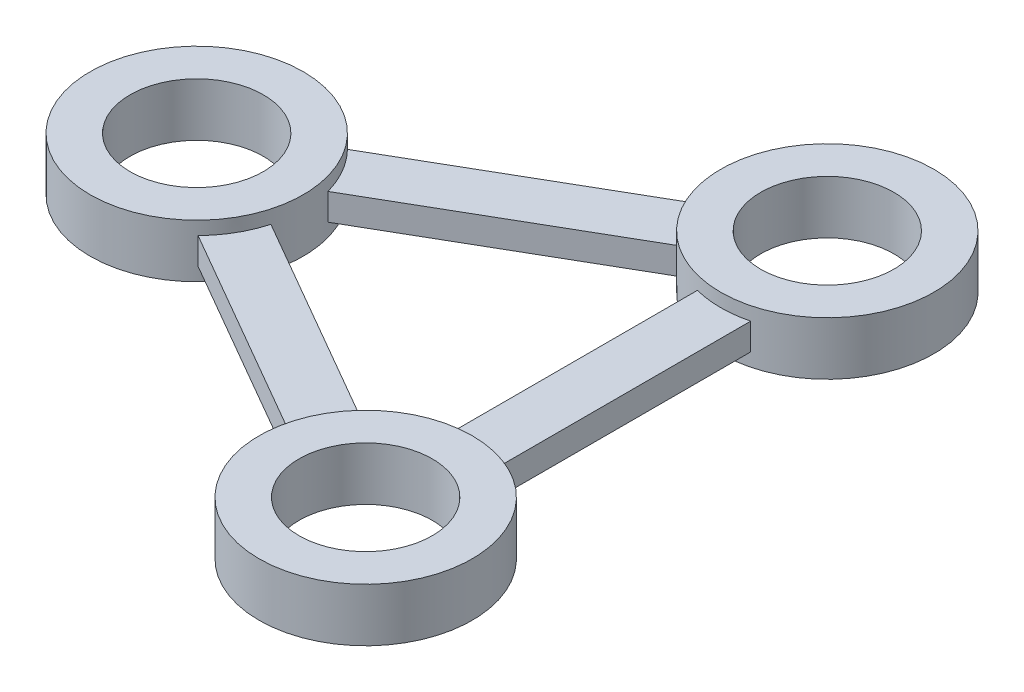
ISO-10303-21;
HEADER;
FILE_DESCRIPTION(('STEP AP214'),'2;1');
FILE_NAME('part.step','',(''),(''),'','','');
FILE_SCHEMA(('AUTOMOTIVE_DESIGN { 1 0 10303 214 1 1 1 1 }'));
ENDSEC;
DATA;
#1=APPLICATION_CONTEXT('core data for automotive mechanical design processes');
#2=APPLICATION_PROTOCOL_DEFINITION('international standard','automotive_design',2000,#1);
#3=PRODUCT_CONTEXT('',#1,'mechanical');
#4=PRODUCT('Part','Part','',(#3));
#5=PRODUCT_RELATED_PRODUCT_CATEGORY('part','',(#4));
#6=PRODUCT_DEFINITION_FORMATION('','',#4);
#7=PRODUCT_DEFINITION_CONTEXT('part definition',#1,'design');
#8=PRODUCT_DEFINITION('design','',#6,#7);
#9=PRODUCT_DEFINITION_SHAPE('','',#8);
#10=(LENGTH_UNIT() NAMED_UNIT(*) SI_UNIT(.MILLI.,.METRE.));
#11=(NAMED_UNIT(*) PLANE_ANGLE_UNIT() SI_UNIT($,.RADIAN.));
#12=(NAMED_UNIT(*) SI_UNIT($,.STERADIAN.) SOLID_ANGLE_UNIT());
#13=UNCERTAINTY_MEASURE_WITH_UNIT(LENGTH_MEASURE(1.E-05),#10,'distance_accuracy_value','');
#14=(GEOMETRIC_REPRESENTATION_CONTEXT(3) GLOBAL_UNCERTAINTY_ASSIGNED_CONTEXT((#13)) GLOBAL_UNIT_ASSIGNED_CONTEXT((#10,
#11,#12)) REPRESENTATION_CONTEXT('',''));
#15=CARTESIAN_POINT('',(0.,0.,0.));
#16=DIRECTION('',(0.,0.,1.));
#17=DIRECTION('',(1.,0.,0.));
#18=AXIS2_PLACEMENT_3D('',#15,#16,#17);
#19=CARTESIAN_POINT('',(0.,10.,173.2));
#20=DIRECTION('',(0.,-1.,0.));
#21=DIRECTION('',(0.,0.,-1.));
#22=AXIS2_PLACEMENT_3D('',#19,#20,#21);
#23=CYLINDRICAL_SURFACE('',#22,25.);
#24=CARTESIAN_POINT('',(0.,10.,173.2));
#25=DIRECTION('',(0.,1.,0.));
#26=DIRECTION('',(0.,0.,1.));
#27=AXIS2_PLACEMENT_3D('',#24,#25,#26);
#28=CIRCLE('',#27,25.);
#29=CARTESIAN_POINT('',(0.,10.,198.2));
#30=VERTEX_POINT('',#29);
#31=EDGE_CURVE('E47',#30,#30,#28,.T.);
#32=ORIENTED_EDGE('',*,*,#31,.T.);
#33=EDGE_LOOP('',(#32));
#34=FACE_BOUND('',#33,.T.);
#35=CARTESIAN_POINT('',(0.,-10.,173.2));
#36=DIRECTION('',(0.,1.,0.));
#37=DIRECTION('',(0.,0.,1.));
#38=AXIS2_PLACEMENT_3D('',#35,#36,#37);
#39=CIRCLE('',#38,25.);
#40=CARTESIAN_POINT('',(0.,-10.,198.2));
#41=VERTEX_POINT('',#40);
#42=EDGE_CURVE('E245',#41,#41,#39,.T.);
#43=ORIENTED_EDGE('',*,*,#42,.F.);
#44=EDGE_LOOP('',(#43));
#45=FACE_BOUND('',#44,.T.);
#46=ADVANCED_FACE('F39',(#34,#45),#23,.F.);
#47=CARTESIAN_POINT('',(0.,10.,173.2));
#48=DIRECTION('',(0.,-1.,0.));
#49=DIRECTION('',(0.,0.,-1.));
#50=AXIS2_PLACEMENT_3D('',#47,#48,#49);
#51=CYLINDRICAL_SURFACE('',#50,40.);
#52=DIRECTION('',(0.,-1.,0.));
#53=VECTOR('',#52,1.);
#54=CARTESIAN_POINT('',(-28.5413756355034,5.,145.175191760993));
#55=LINE('',#54,#53);
#56=CARTESIAN_POINT('',(-28.5413756355034,5.,145.175191760993));
#57=VERTEX_POINT('',#56);
#58=CARTESIAN_POINT('',(-28.5413756355034,-5.,145.175191760993));
#59=VERTEX_POINT('',#58);
#60=EDGE_CURVE('E193',#57,#59,#55,.T.);
#61=ORIENTED_EDGE('',*,*,#60,.F.);
#62=CARTESIAN_POINT('',(0.,5.,173.2));
#63=DIRECTION('',(0.,1.,0.));
#64=DIRECTION('',(0.,0.,1.));
#65=AXIS2_PLACEMENT_3D('',#62,#63,#64);
#66=CIRCLE('',#65,40.);
#67=CARTESIAN_POINT('',(-38.5411556298566,5.,162.495826855139));
#68=VERTEX_POINT('',#67);
#69=EDGE_CURVE('E176',#57,#68,#66,.T.);
#70=ORIENTED_EDGE('',*,*,#69,.T.);
#71=DIRECTION('',(0.,-1.,0.));
#72=VECTOR('',#71,1.);
#73=CARTESIAN_POINT('',(-38.5411556298566,5.,162.495826855139));
#74=LINE('',#73,#72);
#75=CARTESIAN_POINT('',(-38.5411556298566,-5.,162.495826855139));
#76=VERTEX_POINT('',#75);
#77=EDGE_CURVE('E196',#68,#76,#74,.T.);
#78=ORIENTED_EDGE('',*,*,#77,.T.);
#79=CARTESIAN_POINT('',(0.,-5.,173.2));
#80=DIRECTION('',(0.,1.,0.));
#81=DIRECTION('',(0.,0.,1.));
#82=AXIS2_PLACEMENT_3D('',#79,#80,#81);
#83=CIRCLE('',#82,40.);
#84=EDGE_CURVE('E187',#59,#76,#83,.T.);
#85=ORIENTED_EDGE('',*,*,#84,.F.);
#86=EDGE_LOOP('',(#61,#70,#78,#85));
#87=FACE_BOUND('',#86,.T.);
#88=DIRECTION('',(0.,-1.,0.));
#89=VECTOR('',#88,1.);
#90=CARTESIAN_POINT('',(10.0000000000001,5.,134.470166537926));
#91=LINE('',#90,#89);
#92=CARTESIAN_POINT('',(10.0000000000001,5.,134.470166537926));
#93=VERTEX_POINT('',#92);
#94=CARTESIAN_POINT('',(10.0000000000001,-5.,134.470166537926));
#95=VERTEX_POINT('',#94);
#96=EDGE_CURVE('E242',#93,#95,#91,.T.);
#97=ORIENTED_EDGE('',*,*,#96,.F.);
#98=CARTESIAN_POINT('',(0.,5.,173.2));
#99=DIRECTION('',(0.,1.,0.));
#100=DIRECTION('',(0.,0.,1.));
#101=AXIS2_PLACEMENT_3D('',#98,#99,#100);
#102=CIRCLE('',#101,40.);
#103=CARTESIAN_POINT('',(-10.,5.,134.470166537926));
#104=VERTEX_POINT('',#103);
#105=EDGE_CURVE('E214',#93,#104,#102,.T.);
#106=ORIENTED_EDGE('',*,*,#105,.T.);
#107=DIRECTION('',(0.,-1.,0.));
#108=VECTOR('',#107,1.);
#109=CARTESIAN_POINT('',(-10.,5.,134.470166537926));
#110=LINE('',#109,#108);
#111=CARTESIAN_POINT('',(-10.,-5.,134.470166537926));
#112=VERTEX_POINT('',#111);
#113=EDGE_CURVE('E225',#104,#112,#110,.T.);
#114=ORIENTED_EDGE('',*,*,#113,.T.);
#115=CARTESIAN_POINT('',(0.,-5.,173.2));
#116=DIRECTION('',(0.,1.,0.));
#117=DIRECTION('',(0.,0.,1.));
#118=AXIS2_PLACEMENT_3D('',#115,#116,#117);
#119=CIRCLE('',#118,40.);
#120=EDGE_CURVE('E209',#95,#112,#119,.T.);
#121=ORIENTED_EDGE('',*,*,#120,.F.);
#122=EDGE_LOOP('',(#97,#106,#114,#121));
#123=FACE_BOUND('',#122,.T.);
#124=CARTESIAN_POINT('',(0.,10.,173.2));
#125=DIRECTION('',(0.,1.,0.));
#126=DIRECTION('',(0.,0.,1.));
#127=AXIS2_PLACEMENT_3D('',#124,#125,#126);
#128=CIRCLE('',#127,40.);
#129=CARTESIAN_POINT('',(0.,10.,213.2));
#130=VERTEX_POINT('',#129);
#131=EDGE_CURVE('E11',#130,#130,#128,.T.);
#132=ORIENTED_EDGE('',*,*,#131,.F.);
#133=EDGE_LOOP('',(#132));
#134=FACE_BOUND('',#133,.T.);
#135=CARTESIAN_POINT('',(0.,-10.,173.2));
#136=DIRECTION('',(0.,1.,0.));
#137=DIRECTION('',(0.,0.,1.));
#138=AXIS2_PLACEMENT_3D('',#135,#136,#137);
#139=CIRCLE('',#138,40.);
#140=CARTESIAN_POINT('',(0.,-10.,213.2));
#141=VERTEX_POINT('',#140);
#142=EDGE_CURVE('E42',#141,#141,#139,.T.);
#143=ORIENTED_EDGE('',*,*,#142,.T.);
#144=EDGE_LOOP('',(#143));
#145=FACE_BOUND('',#144,.T.);
#146=ADVANCED_FACE('F253',(#87,#123,#134,#145),#51,.T.);
#147=CARTESIAN_POINT('',(0.,10.,0.));
#148=DIRECTION('',(0.,1.,0.));
#149=DIRECTION('',(0.,0.,1.));
#150=AXIS2_PLACEMENT_3D('',#147,#148,#149);
#151=PLANE('',#150);
#152=ORIENTED_EDGE('',*,*,#31,.F.);
#153=EDGE_LOOP('',(#152));
#154=FACE_BOUND('',#153,.T.);
#155=ORIENTED_EDGE('',*,*,#131,.T.);
#156=EDGE_LOOP('',(#155));
#157=FACE_BOUND('',#156,.T.);
#158=ADVANCED_FACE('F258',(#154,#157),#151,.T.);
#159=CARTESIAN_POINT('',(0.,-10.,0.));
#160=DIRECTION('',(0.,1.,0.));
#161=DIRECTION('',(0.,0.,1.));
#162=AXIS2_PLACEMENT_3D('',#159,#160,#161);
#163=PLANE('',#162);
#164=ORIENTED_EDGE('',*,*,#42,.T.);
#165=EDGE_LOOP('',(#164));
#166=FACE_BOUND('',#165,.T.);
#167=ORIENTED_EDGE('',*,*,#142,.F.);
#168=EDGE_LOOP('',(#167));
#169=FACE_BOUND('',#168,.T.);
#170=ADVANCED_FACE('F255',(#166,#169),#163,.F.);
#171=CARTESIAN_POINT('',(9.99999999999986,5.,0.));
#172=DIRECTION('',(1.,0.,0.));
#173=DIRECTION('',(0.,0.,-1.));
#174=AXIS2_PLACEMENT_3D('',#171,#172,#173);
#175=PLANE('',#174);
#176=DIRECTION('',(0.,0.,1.));
#177=VECTOR('',#176,1.);
#178=CARTESIAN_POINT('',(9.99999999999986,-5.,0.));
#179=LINE('',#178,#177);
#180=CARTESIAN_POINT('',(9.99999999999993,-5.,38.7298334620742));
#181=VERTEX_POINT('',#180);
#182=EDGE_CURVE('E228',#181,#95,#179,.T.);
#183=ORIENTED_EDGE('',*,*,#182,.F.);
#184=DIRECTION('',(0.,-1.,0.));
#185=VECTOR('',#184,1.);
#186=CARTESIAN_POINT('',(9.99999999999993,5.,38.7298334620742));
#187=LINE('',#186,#185);
#188=CARTESIAN_POINT('',(9.99999999999993,5.,38.7298334620742));
#189=VERTEX_POINT('',#188);
#190=EDGE_CURVE('E240',#189,#181,#187,.T.);
#191=ORIENTED_EDGE('',*,*,#190,.F.);
#192=DIRECTION('',(0.,0.,1.));
#193=VECTOR('',#192,1.);
#194=CARTESIAN_POINT('',(9.99999999999986,5.,0.));
#195=LINE('',#194,#193);
#196=EDGE_CURVE('E216',#189,#93,#195,.T.);
#197=ORIENTED_EDGE('',*,*,#196,.T.);
#198=ORIENTED_EDGE('',*,*,#96,.T.);
#199=EDGE_LOOP('',(#183,#191,#197,#198));
#200=FACE_BOUND('',#199,.T.);
#201=ADVANCED_FACE('F257',(#200),#175,.T.);
#202=CARTESIAN_POINT('',(-10.0000000000003,5.,0.));
#203=DIRECTION('',(1.,0.,0.));
#204=DIRECTION('',(0.,0.,-1.));
#205=AXIS2_PLACEMENT_3D('',#202,#203,#204);
#206=PLANE('',#205);
#207=DIRECTION('',(0.,0.,1.));
#208=VECTOR('',#207,1.);
#209=CARTESIAN_POINT('',(-10.0000000000003,-5.,0.));
#210=LINE('',#209,#208);
#211=CARTESIAN_POINT('',(-10.0000000000002,-5.,38.7298334620741));
#212=VERTEX_POINT('',#211);
#213=EDGE_CURVE('E217',#212,#112,#210,.T.);
#214=ORIENTED_EDGE('',*,*,#213,.T.);
#215=ORIENTED_EDGE('',*,*,#113,.F.);
#216=DIRECTION('',(0.,0.,1.));
#217=VECTOR('',#216,1.);
#218=CARTESIAN_POINT('',(-10.0000000000003,5.,0.));
#219=LINE('',#218,#217);
#220=CARTESIAN_POINT('',(-10.0000000000002,5.,38.7298334620741));
#221=VERTEX_POINT('',#220);
#222=EDGE_CURVE('E222',#221,#104,#219,.T.);
#223=ORIENTED_EDGE('',*,*,#222,.F.);
#224=DIRECTION('',(0.,-1.,0.));
#225=VECTOR('',#224,1.);
#226=CARTESIAN_POINT('',(-10.0000000000002,5.,38.7298334620741));
#227=LINE('',#226,#225);
#228=EDGE_CURVE('E237',#221,#212,#227,.T.);
#229=ORIENTED_EDGE('',*,*,#228,.T.);
#230=EDGE_LOOP('',(#214,#215,#223,#229));
#231=FACE_BOUND('',#230,.T.);
#232=ADVANCED_FACE('F264',(#231),#206,.F.);
#233=CARTESIAN_POINT('',(0.,5.,0.));
#234=DIRECTION('',(0.,1.,0.));
#235=DIRECTION('',(0.,0.,1.));
#236=AXIS2_PLACEMENT_3D('',#233,#234,#235);
#237=PLANE('',#236);
#238=ORIENTED_EDGE('',*,*,#105,.F.);
#239=ORIENTED_EDGE('',*,*,#196,.F.);
#240=CARTESIAN_POINT('',(0.,5.,0.));
#241=DIRECTION('',(0.,1.,0.));
#242=DIRECTION('',(0.,0.,1.));
#243=AXIS2_PLACEMENT_3D('',#240,#241,#242);
#244=CIRCLE('',#243,40.);
#245=EDGE_CURVE('E220',#221,#189,#244,.T.);
#246=ORIENTED_EDGE('',*,*,#245,.F.);
#247=ORIENTED_EDGE('',*,*,#222,.T.);
#248=EDGE_LOOP('',(#238,#239,#246,#247));
#249=FACE_BOUND('',#248,.T.);
#250=ADVANCED_FACE('F288',(#249),#237,.T.);
#251=CARTESIAN_POINT('',(0.,-5.,0.));
#252=DIRECTION('',(0.,1.,0.));
#253=DIRECTION('',(0.,0.,1.));
#254=AXIS2_PLACEMENT_3D('',#251,#252,#253);
#255=PLANE('',#254);
#256=ORIENTED_EDGE('',*,*,#120,.T.);
#257=ORIENTED_EDGE('',*,*,#213,.F.);
#258=CARTESIAN_POINT('',(0.,-5.,0.));
#259=DIRECTION('',(0.,1.,0.));
#260=DIRECTION('',(0.,0.,1.));
#261=AXIS2_PLACEMENT_3D('',#258,#259,#260);
#262=CIRCLE('',#261,40.);
#263=EDGE_CURVE('E231',#212,#181,#262,.T.);
#264=ORIENTED_EDGE('',*,*,#263,.T.);
#265=ORIENTED_EDGE('',*,*,#182,.T.);
#266=EDGE_LOOP('',(#256,#257,#264,#265));
#267=FACE_BOUND('',#266,.T.);
#268=ADVANCED_FACE('F297',(#267),#255,.F.);
#269=CARTESIAN_POINT('',(0.,10.,0.));
#270=DIRECTION('',(0.,-1.,0.));
#271=DIRECTION('',(0.,0.,-1.));
#272=AXIS2_PLACEMENT_3D('',#269,#270,#271);
#273=CYLINDRICAL_SURFACE('',#272,25.);
#274=CARTESIAN_POINT('',(0.,10.,0.));
#275=DIRECTION('',(0.,1.,0.));
#276=DIRECTION('',(0.,0.,1.));
#277=AXIS2_PLACEMENT_3D('',#274,#275,#276);
#278=CIRCLE('',#277,25.);
#279=CARTESIAN_POINT('',(0.,10.,25.));
#280=VERTEX_POINT('',#279);
#281=EDGE_CURVE('E202',#280,#280,#278,.T.);
#282=ORIENTED_EDGE('',*,*,#281,.T.);
#283=EDGE_LOOP('',(#282));
#284=FACE_BOUND('',#283,.T.);
#285=CARTESIAN_POINT('',(0.,-10.,0.));
#286=DIRECTION('',(0.,1.,0.));
#287=DIRECTION('',(0.,0.,1.));
#288=AXIS2_PLACEMENT_3D('',#285,#286,#287);
#289=CIRCLE('',#288,25.);
#290=CARTESIAN_POINT('',(0.,-10.,25.));
#291=VERTEX_POINT('',#290);
#292=EDGE_CURVE('E201',#291,#291,#289,.T.);
#293=ORIENTED_EDGE('',*,*,#292,.F.);
#294=EDGE_LOOP('',(#293));
#295=FACE_BOUND('',#294,.T.);
#296=ADVANCED_FACE('F299',(#284,#295),#273,.F.);
#297=CARTESIAN_POINT('',(0.,10.,0.));
#298=DIRECTION('',(0.,-1.,0.));
#299=DIRECTION('',(0.,0.,-1.));
#300=AXIS2_PLACEMENT_3D('',#297,#298,#299);
#301=CYLINDRICAL_SURFACE('',#300,40.);
#302=DIRECTION('',(0.,-1.,0.));
#303=VECTOR('',#302,1.);
#304=CARTESIAN_POINT('',(-38.5411556298566,5.,10.7041731448614));
#305=LINE('',#304,#303);
#306=CARTESIAN_POINT('',(-38.5411556298566,5.,10.7041731448614));
#307=VERTEX_POINT('',#306);
#308=CARTESIAN_POINT('',(-38.5411556298566,-5.,10.7041731448614));
#309=VERTEX_POINT('',#308);
#310=EDGE_CURVE('E60',#307,#309,#305,.T.);
#311=ORIENTED_EDGE('',*,*,#310,.F.);
#312=CARTESIAN_POINT('',(0.,5.,0.));
#313=DIRECTION('',(0.,1.,0.));
#314=DIRECTION('',(0.,0.,1.));
#315=AXIS2_PLACEMENT_3D('',#312,#313,#314);
#316=CIRCLE('',#315,40.);
#317=CARTESIAN_POINT('',(-28.5413756355036,5.,28.0248082390064));
#318=VERTEX_POINT('',#317);
#319=EDGE_CURVE('E55',#307,#318,#316,.T.);
#320=ORIENTED_EDGE('',*,*,#319,.T.);
#321=DIRECTION('',(0.,-1.,0.));
#322=VECTOR('',#321,1.);
#323=CARTESIAN_POINT('',(-28.5413756355037,5.,28.0248082390064));
#324=LINE('',#323,#322);
#325=CARTESIAN_POINT('',(-28.5413756355037,-5.,28.0248082390064));
#326=VERTEX_POINT('',#325);
#327=EDGE_CURVE('E125',#318,#326,#324,.T.);
#328=ORIENTED_EDGE('',*,*,#327,.T.);
#329=CARTESIAN_POINT('',(0.,-5.,0.));
#330=DIRECTION('',(0.,1.,0.));
#331=DIRECTION('',(0.,0.,1.));
#332=AXIS2_PLACEMENT_3D('',#329,#330,#331);
#333=CIRCLE('',#332,40.);
#334=EDGE_CURVE('E130',#309,#326,#333,.T.);
#335=ORIENTED_EDGE('',*,*,#334,.F.);
#336=EDGE_LOOP('',(#311,#320,#328,#335));
#337=FACE_BOUND('',#336,.T.);
#338=ORIENTED_EDGE('',*,*,#245,.T.);
#339=ORIENTED_EDGE('',*,*,#190,.T.);
#340=ORIENTED_EDGE('',*,*,#263,.F.);
#341=ORIENTED_EDGE('',*,*,#228,.F.);
#342=EDGE_LOOP('',(#338,#339,#340,#341));
#343=FACE_BOUND('',#342,.T.);
#344=CARTESIAN_POINT('',(0.,10.,0.));
#345=DIRECTION('',(0.,1.,0.));
#346=DIRECTION('',(0.,0.,1.));
#347=AXIS2_PLACEMENT_3D('',#344,#345,#346);
#348=CIRCLE('',#347,40.);
#349=CARTESIAN_POINT('',(0.,10.,40.));
#350=VERTEX_POINT('',#349);
#351=EDGE_CURVE('E205',#350,#350,#348,.T.);
#352=ORIENTED_EDGE('',*,*,#351,.F.);
#353=EDGE_LOOP('',(#352));
#354=FACE_BOUND('',#353,.T.);
#355=CARTESIAN_POINT('',(0.,-10.,0.));
#356=DIRECTION('',(0.,1.,0.));
#357=DIRECTION('',(0.,0.,1.));
#358=AXIS2_PLACEMENT_3D('',#355,#356,#357);
#359=CIRCLE('',#358,40.);
#360=CARTESIAN_POINT('',(0.,-10.,40.));
#361=VERTEX_POINT('',#360);
#362=EDGE_CURVE('E206',#361,#361,#359,.T.);
#363=ORIENTED_EDGE('',*,*,#362,.T.);
#364=EDGE_LOOP('',(#363));
#365=FACE_BOUND('',#364,.T.);
#366=ADVANCED_FACE('F127',(#337,#343,#354,#365),#301,.T.);
#367=CARTESIAN_POINT('',(0.,10.,0.));
#368=DIRECTION('',(0.,1.,0.));
#369=DIRECTION('',(0.,0.,1.));
#370=AXIS2_PLACEMENT_3D('',#367,#368,#369);
#371=PLANE('',#370);
#372=ORIENTED_EDGE('',*,*,#281,.F.);
#373=EDGE_LOOP('',(#372));
#374=FACE_BOUND('',#373,.T.);
#375=ORIENTED_EDGE('',*,*,#351,.T.);
#376=EDGE_LOOP('',(#375));
#377=FACE_BOUND('',#376,.T.);
#378=ADVANCED_FACE('F341',(#374,#377),#371,.T.);
#379=CARTESIAN_POINT('',(0.,-10.,0.));
#380=DIRECTION('',(0.,1.,0.));
#381=DIRECTION('',(0.,0.,1.));
#382=AXIS2_PLACEMENT_3D('',#379,#380,#381);
#383=PLANE('',#382);
#384=ORIENTED_EDGE('',*,*,#292,.T.);
#385=EDGE_LOOP('',(#384));
#386=FACE_BOUND('',#385,.T.);
#387=ORIENTED_EDGE('',*,*,#362,.F.);
#388=EDGE_LOOP('',(#387));
#389=FACE_BOUND('',#388,.T.);
#390=ADVANCED_FACE('F350',(#386,#389),#383,.F.);
#391=CARTESIAN_POINT('',(-79.9965899487759,5.,138.562222775016));
#392=DIRECTION('',(-0.499988999717658,0.,0.86603175470726));
#393=DIRECTION('',(0.86603175470726,0.,0.499988999717658));
#394=AXIS2_PLACEMENT_3D('',#391,#392,#393);
#395=PLANE('',#394);
#396=DIRECTION('',(-0.86603175470726,0.,-0.499988999717658));
#397=VECTOR('',#396,1.);
#398=CARTESIAN_POINT('',(-79.9965899487759,-5.,138.562222775016));
#399=LINE('',#398,#397);
#400=CARTESIAN_POINT('',(-121.458624364497,-5.,114.624808239007));
#401=VERTEX_POINT('',#400);
#402=EDGE_CURVE('E184',#76,#401,#399,.T.);
#403=ORIENTED_EDGE('',*,*,#402,.F.);
#404=ORIENTED_EDGE('',*,*,#77,.F.);
#405=DIRECTION('',(-0.86603175470726,0.,-0.499988999717658));
#406=VECTOR('',#405,1.);
#407=CARTESIAN_POINT('',(-79.9965899487759,5.,138.562222775016));
#408=LINE('',#407,#406);
#409=CARTESIAN_POINT('',(-121.458624364497,5.,114.624808239007));
#410=VERTEX_POINT('',#409);
#411=EDGE_CURVE('E172',#68,#410,#408,.T.);
#412=ORIENTED_EDGE('',*,*,#411,.T.);
#413=DIRECTION('',(0.,-1.,0.));
#414=VECTOR('',#413,1.);
#415=CARTESIAN_POINT('',(-121.458624364497,5.,114.624808239007));
#416=LINE('',#415,#414);
#417=EDGE_CURVE('E198',#410,#401,#416,.T.);
#418=ORIENTED_EDGE('',*,*,#417,.T.);
#419=EDGE_LOOP('',(#403,#404,#412,#418));
#420=FACE_BOUND('',#419,.T.);
#421=ADVANCED_FACE('F360',(#420),#395,.T.);
#422=CARTESIAN_POINT('',(-69.9968099544227,5.,121.241587680871));
#423=DIRECTION('',(-0.499988999717658,0.,0.86603175470726));
#424=DIRECTION('',(0.86603175470726,0.,0.499988999717658));
#425=AXIS2_PLACEMENT_3D('',#422,#423,#424);
#426=PLANE('',#425);
#427=DIRECTION('',(-0.86603175470726,0.,-0.499988999717658));
#428=VECTOR('',#427,1.);
#429=CARTESIAN_POINT('',(-69.9968099544227,-5.,121.241587680871));
#430=LINE('',#429,#428);
#431=CARTESIAN_POINT('',(-111.458844370143,-5.,97.3041731448613));
#432=VERTEX_POINT('',#431);
#433=EDGE_CURVE('E173',#59,#432,#430,.T.);
#434=ORIENTED_EDGE('',*,*,#433,.T.);
#435=DIRECTION('',(0.,-1.,0.));
#436=VECTOR('',#435,1.);
#437=CARTESIAN_POINT('',(-111.458844370143,5.,97.3041731448613));
#438=LINE('',#437,#436);
#439=CARTESIAN_POINT('',(-111.458844370143,5.,97.3041731448613));
#440=VERTEX_POINT('',#439);
#441=EDGE_CURVE('E181',#440,#432,#438,.T.);
#442=ORIENTED_EDGE('',*,*,#441,.F.);
#443=DIRECTION('',(-0.86603175470726,0.,-0.499988999717658));
#444=VECTOR('',#443,1.);
#445=CARTESIAN_POINT('',(-69.9968099544227,5.,121.241587680871));
#446=LINE('',#445,#444);
#447=EDGE_CURVE('E178',#57,#440,#446,.T.);
#448=ORIENTED_EDGE('',*,*,#447,.F.);
#449=ORIENTED_EDGE('',*,*,#60,.T.);
#450=EDGE_LOOP('',(#434,#442,#448,#449));
#451=FACE_BOUND('',#450,.T.);
#452=ADVANCED_FACE('F370',(#451),#426,.F.);
#453=CARTESIAN_POINT('',(0.,5.,0.));
#454=DIRECTION('',(0.,1.,0.));
#455=DIRECTION('',(0.,0.,1.));
#456=AXIS2_PLACEMENT_3D('',#453,#454,#455);
#457=PLANE('',#456);
#458=CARTESIAN_POINT('',(-150.,5.,86.6));
#459=DIRECTION('',(0.,1.,0.));
#460=DIRECTION('',(0.,0.,1.));
#461=AXIS2_PLACEMENT_3D('',#458,#459,#460);
#462=CIRCLE('',#461,40.);
#463=EDGE_CURVE('E170',#410,#440,#462,.T.);
#464=ORIENTED_EDGE('',*,*,#463,.F.);
#465=ORIENTED_EDGE('',*,*,#411,.F.);
#466=ORIENTED_EDGE('',*,*,#69,.F.);
#467=ORIENTED_EDGE('',*,*,#447,.T.);
#468=EDGE_LOOP('',(#464,#465,#466,#467));
#469=FACE_BOUND('',#468,.T.);
#470=ADVANCED_FACE('F381',(#469),#457,.T.);
#471=CARTESIAN_POINT('',(0.,-5.,0.));
#472=DIRECTION('',(0.,1.,0.));
#473=DIRECTION('',(0.,0.,1.));
#474=AXIS2_PLACEMENT_3D('',#471,#472,#473);
#475=PLANE('',#474);
#476=CARTESIAN_POINT('',(-150.,-5.,86.6));
#477=DIRECTION('',(0.,1.,0.));
#478=DIRECTION('',(0.,0.,1.));
#479=AXIS2_PLACEMENT_3D('',#476,#477,#478);
#480=CIRCLE('',#479,40.);
#481=EDGE_CURVE('E165',#401,#432,#480,.T.);
#482=ORIENTED_EDGE('',*,*,#481,.T.);
#483=ORIENTED_EDGE('',*,*,#433,.F.);
#484=ORIENTED_EDGE('',*,*,#84,.T.);
#485=ORIENTED_EDGE('',*,*,#402,.T.);
#486=EDGE_LOOP('',(#482,#483,#484,#485));
#487=FACE_BOUND('',#486,.T.);
#488=ADVANCED_FACE('F392',(#487),#475,.F.);
#489=CARTESIAN_POINT('',(-150.,10.,86.6));
#490=DIRECTION('',(0.,-1.,0.));
#491=DIRECTION('',(0.,0.,-1.));
#492=AXIS2_PLACEMENT_3D('',#489,#490,#491);
#493=CYLINDRICAL_SURFACE('',#492,25.);
#494=CARTESIAN_POINT('',(-150.,10.,86.6));
#495=DIRECTION('',(0.,1.,0.));
#496=DIRECTION('',(0.,0.,1.));
#497=AXIS2_PLACEMENT_3D('',#494,#495,#496);
#498=CIRCLE('',#497,25.);
#499=CARTESIAN_POINT('',(-150.,10.,111.6));
#500=VERTEX_POINT('',#499);
#501=EDGE_CURVE('E158',#500,#500,#498,.T.);
#502=ORIENTED_EDGE('',*,*,#501,.T.);
#503=EDGE_LOOP('',(#502));
#504=FACE_BOUND('',#503,.T.);
#505=CARTESIAN_POINT('',(-150.,-10.,86.6));
#506=DIRECTION('',(0.,1.,0.));
#507=DIRECTION('',(0.,0.,1.));
#508=AXIS2_PLACEMENT_3D('',#505,#506,#507);
#509=CIRCLE('',#508,25.);
#510=CARTESIAN_POINT('',(-150.,-10.,111.6));
#511=VERTEX_POINT('',#510);
#512=EDGE_CURVE('E157',#511,#511,#509,.T.);
#513=ORIENTED_EDGE('',*,*,#512,.F.);
#514=EDGE_LOOP('',(#513));
#515=FACE_BOUND('',#514,.T.);
#516=ADVANCED_FACE('F403',(#504,#515),#493,.F.);
#517=CARTESIAN_POINT('',(-150.,10.,86.6));
#518=DIRECTION('',(0.,-1.,0.));
#519=DIRECTION('',(0.,0.,-1.));
#520=AXIS2_PLACEMENT_3D('',#517,#518,#519);
#521=CYLINDRICAL_SURFACE('',#520,40.);
#522=DIRECTION('',(0.,-1.,0.));
#523=VECTOR('',#522,1.);
#524=CARTESIAN_POINT('',(-111.458844370143,5.,75.8958268551384));
#525=LINE('',#524,#523);
#526=CARTESIAN_POINT('',(-111.458844370143,5.,75.8958268551384));
#527=VERTEX_POINT('',#526);
#528=CARTESIAN_POINT('',(-111.458844370143,-5.,75.8958268551384));
#529=VERTEX_POINT('',#528);
#530=EDGE_CURVE('E133',#527,#529,#525,.T.);
#531=ORIENTED_EDGE('',*,*,#530,.F.);
#532=CARTESIAN_POINT('',(-150.,5.,86.6));
#533=DIRECTION('',(0.,1.,0.));
#534=DIRECTION('',(0.,0.,1.));
#535=AXIS2_PLACEMENT_3D('',#532,#533,#534);
#536=CIRCLE('',#535,40.);
#537=CARTESIAN_POINT('',(-121.458624364497,5.,58.5751917609935));
#538=VERTEX_POINT('',#537);
#539=EDGE_CURVE('E148',#527,#538,#536,.T.);
#540=ORIENTED_EDGE('',*,*,#539,.T.);
#541=DIRECTION('',(0.,-1.,0.));
#542=VECTOR('',#541,1.);
#543=CARTESIAN_POINT('',(-121.458624364497,5.,58.5751917609935));
#544=LINE('',#543,#542);
#545=CARTESIAN_POINT('',(-121.458624364497,-5.,58.5751917609935));
#546=VERTEX_POINT('',#545);
#547=EDGE_CURVE('E152',#538,#546,#544,.T.);
#548=ORIENTED_EDGE('',*,*,#547,.T.);
#549=CARTESIAN_POINT('',(-150.,-5.,86.6));
#550=DIRECTION('',(0.,1.,0.));
#551=DIRECTION('',(0.,0.,1.));
#552=AXIS2_PLACEMENT_3D('',#549,#550,#551);
#553=CIRCLE('',#552,40.);
#554=EDGE_CURVE('E141',#529,#546,#553,.T.);
#555=ORIENTED_EDGE('',*,*,#554,.F.);
#556=EDGE_LOOP('',(#531,#540,#548,#555));
#557=FACE_BOUND('',#556,.T.);
#558=ORIENTED_EDGE('',*,*,#463,.T.);
#559=ORIENTED_EDGE('',*,*,#441,.T.);
#560=ORIENTED_EDGE('',*,*,#481,.F.);
#561=ORIENTED_EDGE('',*,*,#417,.F.);
#562=EDGE_LOOP('',(#558,#559,#560,#561));
#563=FACE_BOUND('',#562,.T.);
#564=CARTESIAN_POINT('',(-150.,10.,86.6));
#565=DIRECTION('',(0.,1.,0.));
#566=DIRECTION('',(0.,0.,1.));
#567=AXIS2_PLACEMENT_3D('',#564,#565,#566);
#568=CIRCLE('',#567,40.);
#569=CARTESIAN_POINT('',(-150.,10.,126.6));
#570=VERTEX_POINT('',#569);
#571=EDGE_CURVE('E161',#570,#570,#568,.T.);
#572=ORIENTED_EDGE('',*,*,#571,.F.);
#573=EDGE_LOOP('',(#572));
#574=FACE_BOUND('',#573,.T.);
#575=CARTESIAN_POINT('',(-150.,-10.,86.6));
#576=DIRECTION('',(0.,1.,0.));
#577=DIRECTION('',(0.,0.,1.));
#578=AXIS2_PLACEMENT_3D('',#575,#576,#577);
#579=CIRCLE('',#578,40.);
#580=CARTESIAN_POINT('',(-150.,-10.,126.6));
#581=VERTEX_POINT('',#580);
#582=EDGE_CURVE('E162',#581,#581,#579,.T.);
#583=ORIENTED_EDGE('',*,*,#582,.T.);
#584=EDGE_LOOP('',(#583));
#585=FACE_BOUND('',#584,.T.);
#586=ADVANCED_FACE('F414',(#557,#563,#574,#585),#521,.T.);
#587=CARTESIAN_POINT('',(0.,10.,0.));
#588=DIRECTION('',(0.,1.,0.));
#589=DIRECTION('',(0.,0.,1.));
#590=AXIS2_PLACEMENT_3D('',#587,#588,#589);
#591=PLANE('',#590);
#592=ORIENTED_EDGE('',*,*,#501,.F.);
#593=EDGE_LOOP('',(#592));
#594=FACE_BOUND('',#593,.T.);
#595=ORIENTED_EDGE('',*,*,#571,.T.);
#596=EDGE_LOOP('',(#595));
#597=FACE_BOUND('',#596,.T.);
#598=ADVANCED_FACE('F424',(#594,#597),#591,.T.);
#599=CARTESIAN_POINT('',(0.,-10.,0.));
#600=DIRECTION('',(0.,1.,0.));
#601=DIRECTION('',(0.,0.,1.));
#602=AXIS2_PLACEMENT_3D('',#599,#600,#601);
#603=PLANE('',#602);
#604=ORIENTED_EDGE('',*,*,#512,.T.);
#605=EDGE_LOOP('',(#604));
#606=FACE_BOUND('',#605,.T.);
#607=ORIENTED_EDGE('',*,*,#582,.F.);
#608=EDGE_LOOP('',(#607));
#609=FACE_BOUND('',#608,.T.);
#610=ADVANCED_FACE('F434',(#606,#609),#603,.F.);
#611=CARTESIAN_POINT('',(4.99988999717645,5.,8.66031754707237));
#612=DIRECTION('',(-0.499988999717658,0.,-0.86603175470726));
#613=DIRECTION('',(-0.86603175470726,0.,0.499988999717658));
#614=AXIS2_PLACEMENT_3D('',#611,#612,#613);
#615=PLANE('',#614);
#616=DIRECTION('',(0.86603175470726,0.,-0.499988999717658));
#617=VECTOR('',#616,1.);
#618=CARTESIAN_POINT('',(4.99988999717645,-5.,8.66031754707237));
#619=LINE('',#618,#617);
#620=EDGE_CURVE('E137',#529,#326,#619,.T.);
#621=ORIENTED_EDGE('',*,*,#620,.T.);
#622=ORIENTED_EDGE('',*,*,#327,.F.);
#623=DIRECTION('',(0.86603175470726,0.,-0.499988999717658));
#624=VECTOR('',#623,1.);
#625=CARTESIAN_POINT('',(4.99988999717645,5.,8.66031754707237));
#626=LINE('',#625,#624);
#627=EDGE_CURVE('E550',#527,#318,#626,.T.);
#628=ORIENTED_EDGE('',*,*,#627,.F.);
#629=ORIENTED_EDGE('',*,*,#530,.T.);
#630=EDGE_LOOP('',(#621,#622,#628,#629));
#631=FACE_BOUND('',#630,.T.);
#632=ADVANCED_FACE('F138',(#631),#615,.F.);
#633=CARTESIAN_POINT('',(-4.99988999717658,5.,-8.66031754707259));
#634=DIRECTION('',(-0.499988999717658,0.,-0.86603175470726));
#635=DIRECTION('',(-0.86603175470726,0.,0.499988999717658));
#636=AXIS2_PLACEMENT_3D('',#633,#634,#635);
#637=PLANE('',#636);
#638=DIRECTION('',(0.86603175470726,0.,-0.499988999717658));
#639=VECTOR('',#638,1.);
#640=CARTESIAN_POINT('',(-4.99988999717658,-5.,-8.66031754707259));
#641=LINE('',#640,#639);
#642=EDGE_CURVE('E146',#546,#309,#641,.T.);
#643=ORIENTED_EDGE('',*,*,#642,.F.);
#644=ORIENTED_EDGE('',*,*,#547,.F.);
#645=DIRECTION('',(0.86603175470726,0.,-0.499988999717658));
#646=VECTOR('',#645,1.);
#647=CARTESIAN_POINT('',(-4.99988999717658,5.,-8.66031754707259));
#648=LINE('',#647,#646);
#649=EDGE_CURVE('E154',#538,#307,#648,.T.);
#650=ORIENTED_EDGE('',*,*,#649,.T.);
#651=ORIENTED_EDGE('',*,*,#310,.T.);
#652=EDGE_LOOP('',(#643,#644,#650,#651));
#653=FACE_BOUND('',#652,.T.);
#654=ADVANCED_FACE('F453',(#653),#637,.T.);
#655=CARTESIAN_POINT('',(0.,5.,0.));
#656=DIRECTION('',(0.,1.,0.));
#657=DIRECTION('',(0.,0.,1.));
#658=AXIS2_PLACEMENT_3D('',#655,#656,#657);
#659=PLANE('',#658);
#660=ORIENTED_EDGE('',*,*,#539,.F.);
#661=ORIENTED_EDGE('',*,*,#627,.T.);
#662=ORIENTED_EDGE('',*,*,#319,.F.);
#663=ORIENTED_EDGE('',*,*,#649,.F.);
#664=EDGE_LOOP('',(#660,#661,#662,#663));
#665=FACE_BOUND('',#664,.T.);
#666=ADVANCED_FACE('F463',(#665),#659,.T.);
#667=CARTESIAN_POINT('',(0.,-5.,0.));
#668=DIRECTION('',(0.,1.,0.));
#669=DIRECTION('',(0.,0.,1.));
#670=AXIS2_PLACEMENT_3D('',#667,#668,#669);
#671=PLANE('',#670);
#672=ORIENTED_EDGE('',*,*,#554,.T.);
#673=ORIENTED_EDGE('',*,*,#642,.T.);
#674=ORIENTED_EDGE('',*,*,#334,.T.);
#675=ORIENTED_EDGE('',*,*,#620,.F.);
#676=EDGE_LOOP('',(#672,#673,#674,#675));
#677=FACE_BOUND('',#676,.T.);
#678=ADVANCED_FACE('F144',(#677),#671,.F.);
#679=CLOSED_SHELL('',(#46,#146,#158,#170,#201,#232,#250,#268,#296,#366,#378,#390,#421,#452,#470,
#488,#516,#586,#598,#610,#632,#654,#666,#678));
#680=MANIFOLD_SOLID_BREP('B2',#679);
#681=ADVANCED_BREP_SHAPE_REPRESENTATION('',(#18,#680),#14);
#682=SHAPE_DEFINITION_REPRESENTATION(#9,#681);
ENDSEC;
END-ISO-10303-21;
